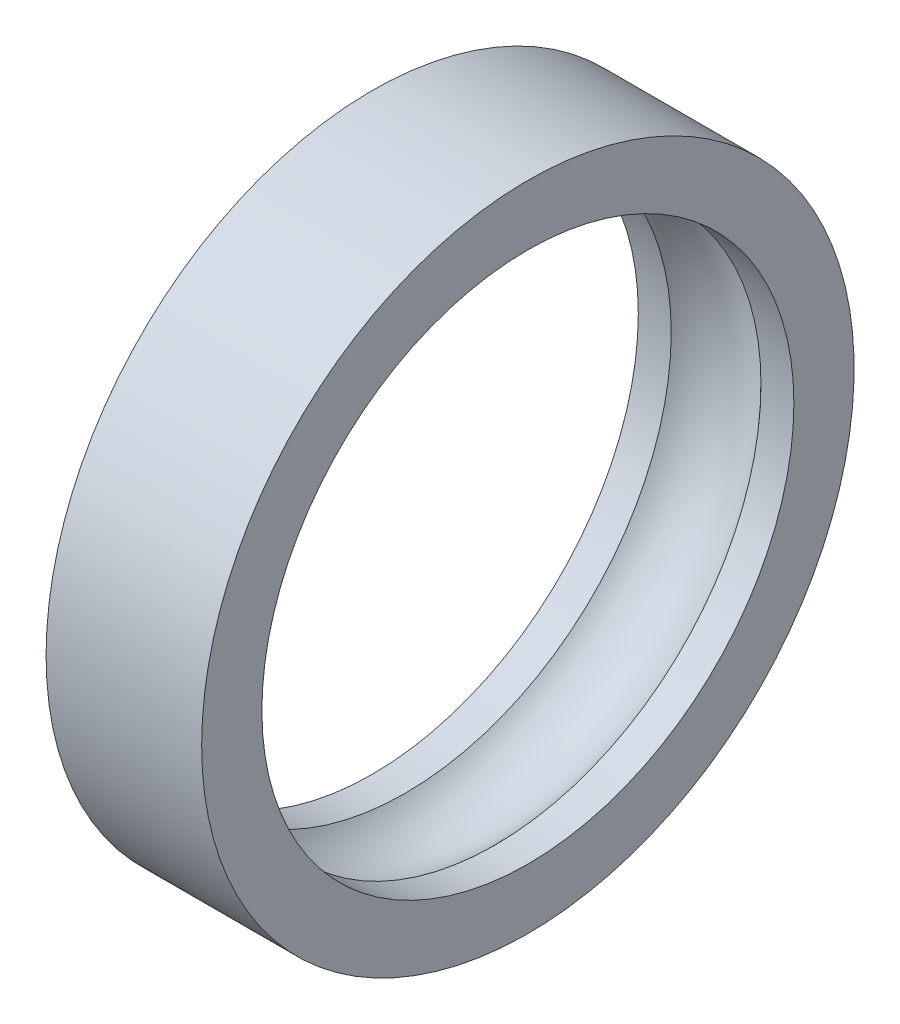
ISO-10303-21;
HEADER;
FILE_DESCRIPTION(('STEP AP214'),'2;1');
FILE_NAME('part.step','',(''),(''),'','','');
FILE_SCHEMA(('AUTOMOTIVE_DESIGN { 1 0 10303 214 1 1 1 1 }'));
ENDSEC;
DATA;
#1=APPLICATION_CONTEXT('core data for automotive mechanical design processes');
#2=APPLICATION_PROTOCOL_DEFINITION('international standard','automotive_design',2000,#1);
#3=PRODUCT_CONTEXT('',#1,'mechanical');
#4=PRODUCT('Part','Part','',(#3));
#5=PRODUCT_RELATED_PRODUCT_CATEGORY('part','',(#4));
#6=PRODUCT_DEFINITION_FORMATION('','',#4);
#7=PRODUCT_DEFINITION_CONTEXT('part definition',#1,'design');
#8=PRODUCT_DEFINITION('design','',#6,#7);
#9=PRODUCT_DEFINITION_SHAPE('','',#8);
#10=(LENGTH_UNIT() NAMED_UNIT(*) SI_UNIT(.MILLI.,.METRE.));
#11=(NAMED_UNIT(*) PLANE_ANGLE_UNIT() SI_UNIT($,.RADIAN.));
#12=(NAMED_UNIT(*) SI_UNIT($,.STERADIAN.) SOLID_ANGLE_UNIT());
#13=UNCERTAINTY_MEASURE_WITH_UNIT(LENGTH_MEASURE(1.E-05),#10,'distance_accuracy_value','');
#14=(GEOMETRIC_REPRESENTATION_CONTEXT(3) GLOBAL_UNCERTAINTY_ASSIGNED_CONTEXT((#13)) GLOBAL_UNIT_ASSIGNED_CONTEXT((#10,
#11,#12)) REPRESENTATION_CONTEXT('',''));
#15=CARTESIAN_POINT('',(0.,0.,0.));
#16=DIRECTION('',(0.,0.,1.));
#17=DIRECTION('',(1.,0.,0.));
#18=AXIS2_PLACEMENT_3D('',#15,#16,#17);
#19=CARTESIAN_POINT('',(0.,0.,0.));
#20=DIRECTION('',(-1.,0.,0.));
#21=DIRECTION('',(0.,0.,1.));
#22=AXIS2_PLACEMENT_3D('',#19,#20,#21);
#23=CYLINDRICAL_SURFACE('',#22,26.5);
#24=CARTESIAN_POINT('',(-4.47213595499958,0.,0.));
#25=DIRECTION('',(-1.,0.,0.));
#26=DIRECTION('',(0.,0.,1.));
#27=AXIS2_PLACEMENT_3D('',#24,#25,#26);
#28=CIRCLE('',#27,26.5);
#29=CARTESIAN_POINT('',(-4.47213595499958,0.,26.5));
#30=VERTEX_POINT('',#29);
#31=EDGE_CURVE('E66',#30,#30,#28,.T.);
#32=ORIENTED_EDGE('',*,*,#31,.F.);
#33=EDGE_LOOP('',(#32));
#34=FACE_BOUND('',#33,.T.);
#35=CARTESIAN_POINT('',(-7.75,0.,0.));
#36=DIRECTION('',(-1.,0.,0.));
#37=DIRECTION('',(0.,0.,1.));
#38=AXIS2_PLACEMENT_3D('',#35,#36,#37);
#39=CIRCLE('',#38,26.5);
#40=CARTESIAN_POINT('',(-7.75,0.,26.5));
#41=VERTEX_POINT('',#40);
#42=EDGE_CURVE('E63',#41,#41,#39,.T.);
#43=ORIENTED_EDGE('',*,*,#42,.T.);
#44=EDGE_LOOP('',(#43));
#45=FACE_BOUND('',#44,.T.);
#46=ADVANCED_FACE('F43',(#34,#45),#23,.F.);
#47=CARTESIAN_POINT('',(0.,0.,0.));
#48=DIRECTION('',(-1.,0.,0.));
#49=DIRECTION('',(0.,0.,1.));
#50=AXIS2_PLACEMENT_3D('',#47,#48,#49);
#51=TOROIDAL_SURFACE('',#50,22.5,6.);
#52=ORIENTED_EDGE('',*,*,#31,.T.);
#53=EDGE_LOOP('',(#52));
#54=FACE_BOUND('',#53,.T.);
#55=CARTESIAN_POINT('',(4.47213595499958,0.,0.));
#56=DIRECTION('',(-1.,0.,0.));
#57=DIRECTION('',(0.,0.,1.));
#58=AXIS2_PLACEMENT_3D('',#55,#56,#57);
#59=CIRCLE('',#58,26.5);
#60=CARTESIAN_POINT('',(4.47213595499958,0.,26.5));
#61=VERTEX_POINT('',#60);
#62=EDGE_CURVE('E10',#61,#61,#59,.T.);
#63=ORIENTED_EDGE('',*,*,#62,.F.);
#64=EDGE_LOOP('',(#63));
#65=FACE_BOUND('',#64,.T.);
#66=ADVANCED_FACE('F45',(#54,#65),#51,.F.);
#67=CARTESIAN_POINT('',(-7.75,0.,0.));
#68=DIRECTION('',(1.,0.,0.));
#69=DIRECTION('',(0.,0.,-1.));
#70=AXIS2_PLACEMENT_3D('',#67,#68,#69);
#71=PLANE('',#70);
#72=ORIENTED_EDGE('',*,*,#42,.F.);
#73=EDGE_LOOP('',(#72));
#74=FACE_BOUND('',#73,.T.);
#75=CARTESIAN_POINT('',(-7.75,0.,0.));
#76=DIRECTION('',(-1.,0.,0.));
#77=DIRECTION('',(0.,0.,1.));
#78=AXIS2_PLACEMENT_3D('',#75,#76,#77);
#79=CIRCLE('',#78,32.5);
#80=CARTESIAN_POINT('',(-7.75,0.,32.5));
#81=VERTEX_POINT('',#80);
#82=EDGE_CURVE('E58',#81,#81,#79,.T.);
#83=ORIENTED_EDGE('',*,*,#82,.T.);
#84=EDGE_LOOP('',(#83));
#85=FACE_BOUND('',#84,.T.);
#86=ADVANCED_FACE('F75',(#74,#85),#71,.F.);
#87=CARTESIAN_POINT('',(0.,0.,0.));
#88=DIRECTION('',(-1.,0.,0.));
#89=DIRECTION('',(0.,0.,1.));
#90=AXIS2_PLACEMENT_3D('',#87,#88,#89);
#91=CYLINDRICAL_SURFACE('',#90,32.5);
#92=CARTESIAN_POINT('',(7.75,0.,0.));
#93=DIRECTION('',(-1.,0.,0.));
#94=DIRECTION('',(0.,0.,1.));
#95=AXIS2_PLACEMENT_3D('',#92,#93,#94);
#96=CIRCLE('',#95,32.5);
#97=CARTESIAN_POINT('',(7.75,0.,32.5));
#98=VERTEX_POINT('',#97);
#99=EDGE_CURVE('E54',#98,#98,#96,.T.);
#100=ORIENTED_EDGE('',*,*,#99,.T.);
#101=EDGE_LOOP('',(#100));
#102=FACE_BOUND('',#101,.T.);
#103=ORIENTED_EDGE('',*,*,#82,.F.);
#104=EDGE_LOOP('',(#103));
#105=FACE_BOUND('',#104,.T.);
#106=ADVANCED_FACE('F80',(#102,#105),#91,.T.);
#107=CARTESIAN_POINT('',(7.75,0.,0.));
#108=DIRECTION('',(1.,0.,0.));
#109=DIRECTION('',(0.,0.,-1.));
#110=AXIS2_PLACEMENT_3D('',#107,#108,#109);
#111=PLANE('',#110);
#112=CARTESIAN_POINT('',(7.75,0.,0.));
#113=DIRECTION('',(-1.,0.,0.));
#114=DIRECTION('',(0.,0.,1.));
#115=AXIS2_PLACEMENT_3D('',#112,#113,#114);
#116=CIRCLE('',#115,26.5);
#117=CARTESIAN_POINT('',(7.75,0.,26.5));
#118=VERTEX_POINT('',#117);
#119=EDGE_CURVE('E50',#118,#118,#116,.T.);
#120=ORIENTED_EDGE('',*,*,#119,.T.);
#121=EDGE_LOOP('',(#120));
#122=FACE_BOUND('',#121,.T.);
#123=ORIENTED_EDGE('',*,*,#99,.F.);
#124=EDGE_LOOP('',(#123));
#125=FACE_BOUND('',#124,.T.);
#126=ADVANCED_FACE('F85',(#122,#125),#111,.T.);
#127=CARTESIAN_POINT('',(0.,0.,0.));
#128=DIRECTION('',(-1.,0.,0.));
#129=DIRECTION('',(0.,0.,1.));
#130=AXIS2_PLACEMENT_3D('',#127,#128,#129);
#131=CYLINDRICAL_SURFACE('',#130,26.5);
#132=ORIENTED_EDGE('',*,*,#119,.F.);
#133=EDGE_LOOP('',(#132));
#134=FACE_BOUND('',#133,.T.);
#135=ORIENTED_EDGE('',*,*,#62,.T.);
#136=EDGE_LOOP('',(#135));
#137=FACE_BOUND('',#136,.T.);
#138=ADVANCED_FACE('F91',(#134,#137),#131,.F.);
#139=CLOSED_SHELL('',(#46,#66,#86,#106,#126,#138));
#140=MANIFOLD_SOLID_BREP('B2',#139);
#141=ADVANCED_BREP_SHAPE_REPRESENTATION('',(#18,#140),#14);
#142=SHAPE_DEFINITION_REPRESENTATION(#9,#141);
ENDSEC;
END-ISO-10303-21;
